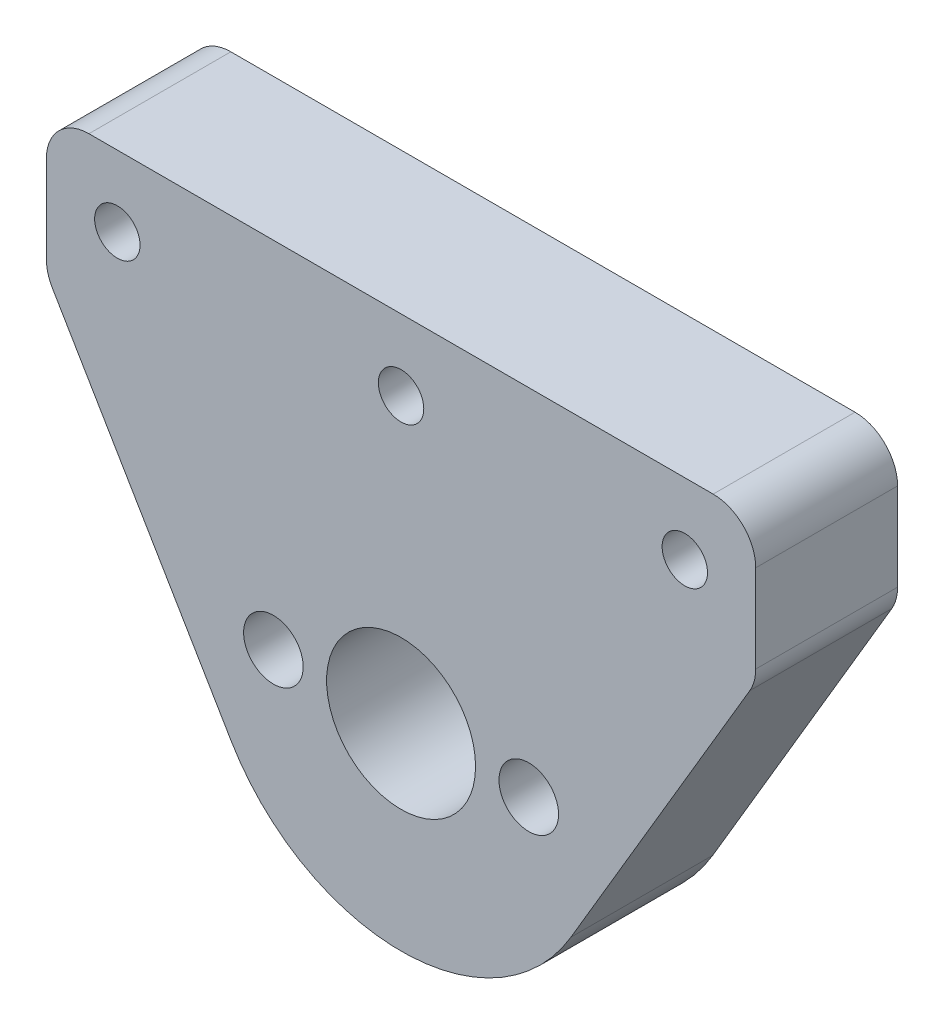
ISO-10303-21;
HEADER;
FILE_DESCRIPTION(('STEP AP214'),'2;1');
FILE_NAME('part.step','',(''),(''),'','','');
FILE_SCHEMA(('AUTOMOTIVE_DESIGN { 1 0 10303 214 1 1 1 1 }'));
ENDSEC;
DATA;
#1=APPLICATION_CONTEXT('core data for automotive mechanical design processes');
#2=APPLICATION_PROTOCOL_DEFINITION('international standard','automotive_design',2000,#1);
#3=PRODUCT_CONTEXT('',#1,'mechanical');
#4=PRODUCT('Part','Part','',(#3));
#5=PRODUCT_RELATED_PRODUCT_CATEGORY('part','',(#4));
#6=PRODUCT_DEFINITION_FORMATION('','',#4);
#7=PRODUCT_DEFINITION_CONTEXT('part definition',#1,'design');
#8=PRODUCT_DEFINITION('design','',#6,#7);
#9=PRODUCT_DEFINITION_SHAPE('','',#8);
#10=(LENGTH_UNIT() NAMED_UNIT(*) SI_UNIT(.MILLI.,.METRE.));
#11=(NAMED_UNIT(*) PLANE_ANGLE_UNIT() SI_UNIT($,.RADIAN.));
#12=(NAMED_UNIT(*) SI_UNIT($,.STERADIAN.) SOLID_ANGLE_UNIT());
#13=UNCERTAINTY_MEASURE_WITH_UNIT(LENGTH_MEASURE(1.E-05),#10,'distance_accuracy_value','');
#14=(GEOMETRIC_REPRESENTATION_CONTEXT(3) GLOBAL_UNCERTAINTY_ASSIGNED_CONTEXT((#13)) GLOBAL_UNIT_ASSIGNED_CONTEXT((#10,
#11,#12)) REPRESENTATION_CONTEXT('',''));
#15=CARTESIAN_POINT('',(0.,0.,0.));
#16=DIRECTION('',(0.,0.,1.));
#17=DIRECTION('',(1.,0.,0.));
#18=AXIS2_PLACEMENT_3D('',#15,#16,#17);
#19=CARTESIAN_POINT('',(0.,-20.,10.));
#20=DIRECTION('',(0.,0.,-1.));
#21=DIRECTION('',(-1.,0.,0.));
#22=AXIS2_PLACEMENT_3D('',#19,#20,#21);
#23=CYLINDRICAL_SURFACE('',#22,13.9);
#24=CARTESIAN_POINT('',(0.,-20.,0.));
#25=DIRECTION('',(0.,0.,1.));
#26=DIRECTION('',(1.,0.,0.));
#27=AXIS2_PLACEMENT_3D('',#24,#25,#26);
#28=CIRCLE('',#27,13.9);
#29=CARTESIAN_POINT('',(-11.9690237254858,-27.067706209143,0.));
#30=VERTEX_POINT('',#29);
#31=CARTESIAN_POINT('',(11.9690237254858,-27.067706209143,0.));
#32=VERTEX_POINT('',#31);
#33=EDGE_CURVE('E145',#30,#32,#28,.T.);
#34=ORIENTED_EDGE('',*,*,#33,.T.);
#35=DIRECTION('',(0.,0.,-1.));
#36=VECTOR('',#35,1.);
#37=CARTESIAN_POINT('',(11.9690237254858,-27.067706209143,10.));
#38=LINE('',#37,#36);
#39=CARTESIAN_POINT('',(11.9690237254858,-27.067706209143,10.));
#40=VERTEX_POINT('',#39);
#41=EDGE_CURVE('E124',#40,#32,#38,.T.);
#42=ORIENTED_EDGE('',*,*,#41,.F.);
#43=CARTESIAN_POINT('',(0.,-20.,10.));
#44=DIRECTION('',(0.,0.,1.));
#45=DIRECTION('',(1.,0.,0.));
#46=AXIS2_PLACEMENT_3D('',#43,#44,#45);
#47=CIRCLE('',#46,13.9);
#48=CARTESIAN_POINT('',(-11.9690237254858,-27.067706209143,10.));
#49=VERTEX_POINT('',#48);
#50=EDGE_CURVE('E130',#49,#40,#47,.T.);
#51=ORIENTED_EDGE('',*,*,#50,.F.);
#52=DIRECTION('',(0.,0.,-1.));
#53=VECTOR('',#52,1.);
#54=CARTESIAN_POINT('',(-11.9690237254858,-27.067706209143,10.));
#55=LINE('',#54,#53);
#56=EDGE_CURVE('E148',#49,#30,#55,.T.);
#57=ORIENTED_EDGE('',*,*,#56,.T.);
#58=EDGE_LOOP('',(#34,#42,#51,#57));
#59=FACE_BOUND('',#58,.T.);
#60=ADVANCED_FACE('F40',(#59),#23,.T.);
#61=CARTESIAN_POINT('',(20.7256660630455,-12.2385018262184,10.));
#62=DIRECTION('',(0.861080843560131,-0.50846807260021,0.));
#63=DIRECTION('',(0.50846807260021,0.861080843560131,0.));
#64=AXIS2_PLACEMENT_3D('',#61,#62,#63);
#65=PLANE('',#64);
#66=DIRECTION('',(-0.50846807260021,-0.861080843560131,0.));
#67=VECTOR('',#66,1.);
#68=CARTESIAN_POINT('',(20.7256660630455,-12.2385018262184,0.));
#69=LINE('',#68,#67);
#70=CARTESIAN_POINT('',(24.5832425306803,-5.70577071123963,0.));
#71=VERTEX_POINT('',#70);
#72=EDGE_CURVE('E228',#71,#32,#69,.T.);
#73=ORIENTED_EDGE('',*,*,#72,.F.);
#74=DIRECTION('',(0.,0.,-1.));
#75=VECTOR('',#74,1.);
#76=CARTESIAN_POINT('',(24.5832425306803,-5.70577071123963,10.));
#77=LINE('',#76,#75);
#78=CARTESIAN_POINT('',(24.5832425306803,-5.70577071123963,10.));
#79=VERTEX_POINT('',#78);
#80=EDGE_CURVE('E11',#71,#79,#77,.F.);
#81=ORIENTED_EDGE('',*,*,#80,.T.);
#82=DIRECTION('',(-0.50846807260021,-0.861080843560131,0.));
#83=VECTOR('',#82,1.);
#84=CARTESIAN_POINT('',(20.7256660630455,-12.2385018262184,10.));
#85=LINE('',#84,#83);
#86=EDGE_CURVE('E119',#79,#40,#85,.T.);
#87=ORIENTED_EDGE('',*,*,#86,.T.);
#88=ORIENTED_EDGE('',*,*,#41,.T.);
#89=EDGE_LOOP('',(#73,#81,#87,#88));
#90=FACE_BOUND('',#89,.T.);
#91=ADVANCED_FACE('F122',(#90),#65,.T.);
#92=CARTESIAN_POINT('',(24.9999999999999,0.,10.));
#93=DIRECTION('',(1.,0.,0.));
#94=DIRECTION('',(0.,1.,0.));
#95=AXIS2_PLACEMENT_3D('',#92,#93,#94);
#96=PLANE('',#95);
#97=DIRECTION('',(0.,-1.,0.));
#98=VECTOR('',#97,1.);
#99=CARTESIAN_POINT('',(24.9999999999999,0.,0.));
#100=LINE('',#99,#98);
#101=CARTESIAN_POINT('',(24.9999999999999,2.,0.));
#102=VERTEX_POINT('',#101);
#103=CARTESIAN_POINT('',(24.9999999999999,-4.180366493439,0.));
#104=VERTEX_POINT('',#103);
#105=EDGE_CURVE('E205',#102,#104,#100,.T.);
#106=ORIENTED_EDGE('',*,*,#105,.F.);
#107=DIRECTION('',(0.,0.,-1.));
#108=VECTOR('',#107,1.);
#109=CARTESIAN_POINT('',(24.9999999999999,2.,10.));
#110=LINE('',#109,#108);
#111=CARTESIAN_POINT('',(24.9999999999999,2.,10.));
#112=VERTEX_POINT('',#111);
#113=EDGE_CURVE('E49',#102,#112,#110,.F.);
#114=ORIENTED_EDGE('',*,*,#113,.T.);
#115=DIRECTION('',(0.,-1.,0.));
#116=VECTOR('',#115,1.);
#117=CARTESIAN_POINT('',(24.9999999999999,0.,10.));
#118=LINE('',#117,#116);
#119=CARTESIAN_POINT('',(24.9999999999999,-4.180366493439,10.));
#120=VERTEX_POINT('',#119);
#121=EDGE_CURVE('E129',#112,#120,#118,.T.);
#122=ORIENTED_EDGE('',*,*,#121,.T.);
#123=DIRECTION('',(0.,0.,-1.));
#124=VECTOR('',#123,1.);
#125=CARTESIAN_POINT('',(24.9999999999999,-4.180366493439,10.));
#126=LINE('',#125,#124);
#127=EDGE_CURVE('E194',#120,#104,#126,.T.);
#128=ORIENTED_EDGE('',*,*,#127,.T.);
#129=EDGE_LOOP('',(#106,#114,#122,#128));
#130=FACE_BOUND('',#129,.T.);
#131=ADVANCED_FACE('F202',(#130),#96,.T.);
#132=CARTESIAN_POINT('',(0.,5.,10.));
#133=DIRECTION('',(0.,-1.,0.));
#134=DIRECTION('',(1.,0.,0.));
#135=AXIS2_PLACEMENT_3D('',#132,#133,#134);
#136=PLANE('',#135);
#137=DIRECTION('',(-1.,0.,0.));
#138=VECTOR('',#137,1.);
#139=CARTESIAN_POINT('',(0.,5.,0.));
#140=LINE('',#139,#138);
#141=CARTESIAN_POINT('',(21.9999999999999,5.,0.));
#142=VERTEX_POINT('',#141);
#143=CARTESIAN_POINT('',(-22.,5.,0.));
#144=VERTEX_POINT('',#143);
#145=EDGE_CURVE('E214',#142,#144,#140,.T.);
#146=ORIENTED_EDGE('',*,*,#145,.T.);
#147=DIRECTION('',(0.,0.,-1.));
#148=VECTOR('',#147,1.);
#149=CARTESIAN_POINT('',(-22.,5.,10.));
#150=LINE('',#149,#148);
#151=CARTESIAN_POINT('',(-22.,5.,10.));
#152=VERTEX_POINT('',#151);
#153=EDGE_CURVE('E56',#144,#152,#150,.F.);
#154=ORIENTED_EDGE('',*,*,#153,.T.);
#155=DIRECTION('',(-1.,0.,0.));
#156=VECTOR('',#155,1.);
#157=CARTESIAN_POINT('',(0.,5.,10.));
#158=LINE('',#157,#156);
#159=CARTESIAN_POINT('',(21.9999999999999,5.,10.));
#160=VERTEX_POINT('',#159);
#161=EDGE_CURVE('E208',#160,#152,#158,.T.);
#162=ORIENTED_EDGE('',*,*,#161,.F.);
#163=DIRECTION('',(0.,0.,-1.));
#164=VECTOR('',#163,1.);
#165=CARTESIAN_POINT('',(21.9999999999999,5.,0.));
#166=LINE('',#165,#164);
#167=EDGE_CURVE('E188',#160,#142,#166,.T.);
#168=ORIENTED_EDGE('',*,*,#167,.T.);
#169=EDGE_LOOP('',(#146,#154,#162,#168));
#170=FACE_BOUND('',#169,.T.);
#171=ADVANCED_FACE('F213',(#170),#136,.F.);
#172=CARTESIAN_POINT('',(-25.,0.,10.));
#173=DIRECTION('',(1.,0.,0.));
#174=DIRECTION('',(0.,1.,0.));
#175=AXIS2_PLACEMENT_3D('',#172,#173,#174);
#176=PLANE('',#175);
#177=DIRECTION('',(0.,-1.,0.));
#178=VECTOR('',#177,1.);
#179=CARTESIAN_POINT('',(-25.,0.,0.));
#180=LINE('',#179,#178);
#181=CARTESIAN_POINT('',(-25.,2.,0.));
#182=VERTEX_POINT('',#181);
#183=CARTESIAN_POINT('',(-25.,-4.18036649343903,0.));
#184=VERTEX_POINT('',#183);
#185=EDGE_CURVE('E221',#182,#184,#180,.T.);
#186=ORIENTED_EDGE('',*,*,#185,.T.);
#187=DIRECTION('',(0.,0.,-1.));
#188=VECTOR('',#187,1.);
#189=CARTESIAN_POINT('',(-25.,-4.18036649343903,10.));
#190=LINE('',#189,#188);
#191=CARTESIAN_POINT('',(-25.,-4.18036649343903,10.));
#192=VERTEX_POINT('',#191);
#193=EDGE_CURVE('E174',#184,#192,#190,.F.);
#194=ORIENTED_EDGE('',*,*,#193,.T.);
#195=DIRECTION('',(0.,-1.,0.));
#196=VECTOR('',#195,1.);
#197=CARTESIAN_POINT('',(-25.,0.,10.));
#198=LINE('',#197,#196);
#199=CARTESIAN_POINT('',(-25.,2.,10.));
#200=VERTEX_POINT('',#199);
#201=EDGE_CURVE('E318',#200,#192,#198,.T.);
#202=ORIENTED_EDGE('',*,*,#201,.F.);
#203=DIRECTION('',(0.,0.,-1.));
#204=VECTOR('',#203,1.);
#205=CARTESIAN_POINT('',(-25.,2.,10.));
#206=LINE('',#205,#204);
#207=EDGE_CURVE('E170',#200,#182,#206,.T.);
#208=ORIENTED_EDGE('',*,*,#207,.T.);
#209=EDGE_LOOP('',(#186,#194,#202,#208));
#210=FACE_BOUND('',#209,.T.);
#211=ADVANCED_FACE('F335',(#210),#176,.F.);
#212=CARTESIAN_POINT('',(-20.,0.,10.));
#213=DIRECTION('',(0.,0.,-1.));
#214=DIRECTION('',(-1.,0.,0.));
#215=AXIS2_PLACEMENT_3D('',#212,#213,#214);
#216=CYLINDRICAL_SURFACE('',#215,1.6);
#217=CARTESIAN_POINT('',(-20.,0.,10.));
#218=DIRECTION('',(0.,0.,1.));
#219=DIRECTION('',(1.,0.,0.));
#220=AXIS2_PLACEMENT_3D('',#217,#218,#219);
#221=CIRCLE('',#220,1.6);
#222=CARTESIAN_POINT('',(-18.4,0.,10.));
#223=VERTEX_POINT('',#222);
#224=EDGE_CURVE('E300',#223,#223,#221,.T.);
#225=ORIENTED_EDGE('',*,*,#224,.T.);
#226=EDGE_LOOP('',(#225));
#227=FACE_BOUND('',#226,.T.);
#228=CARTESIAN_POINT('',(-20.,0.,0.));
#229=DIRECTION('',(0.,0.,1.));
#230=DIRECTION('',(1.,0.,0.));
#231=AXIS2_PLACEMENT_3D('',#228,#229,#230);
#232=CIRCLE('',#231,1.6);
#233=CARTESIAN_POINT('',(-18.4,0.,0.));
#234=VERTEX_POINT('',#233);
#235=EDGE_CURVE('E246',#234,#234,#232,.T.);
#236=ORIENTED_EDGE('',*,*,#235,.F.);
#237=EDGE_LOOP('',(#236));
#238=FACE_BOUND('',#237,.T.);
#239=ADVANCED_FACE('F356',(#227,#238),#216,.F.);
#240=CARTESIAN_POINT('',(0.,0.,10.));
#241=DIRECTION('',(0.,0.,-1.));
#242=DIRECTION('',(-1.,0.,0.));
#243=AXIS2_PLACEMENT_3D('',#240,#241,#242);
#244=CYLINDRICAL_SURFACE('',#243,1.6);
#245=CARTESIAN_POINT('',(0.,0.,10.));
#246=DIRECTION('',(0.,0.,1.));
#247=DIRECTION('',(1.,0.,0.));
#248=AXIS2_PLACEMENT_3D('',#245,#246,#247);
#249=CIRCLE('',#248,1.6);
#250=CARTESIAN_POINT('',(1.6,0.,10.));
#251=VERTEX_POINT('',#250);
#252=EDGE_CURVE('E304',#251,#251,#249,.T.);
#253=ORIENTED_EDGE('',*,*,#252,.T.);
#254=EDGE_LOOP('',(#253));
#255=FACE_BOUND('',#254,.T.);
#256=CARTESIAN_POINT('',(0.,0.,0.));
#257=DIRECTION('',(0.,0.,1.));
#258=DIRECTION('',(1.,0.,0.));
#259=AXIS2_PLACEMENT_3D('',#256,#257,#258);
#260=CIRCLE('',#259,1.6);
#261=CARTESIAN_POINT('',(1.6,0.,0.));
#262=VERTEX_POINT('',#261);
#263=EDGE_CURVE('E242',#262,#262,#260,.T.);
#264=ORIENTED_EDGE('',*,*,#263,.F.);
#265=EDGE_LOOP('',(#264));
#266=FACE_BOUND('',#265,.T.);
#267=ADVANCED_FACE('F377',(#255,#266),#244,.F.);
#268=CARTESIAN_POINT('',(9.,-20.,10.));
#269=DIRECTION('',(0.,0.,-1.));
#270=DIRECTION('',(-1.,0.,0.));
#271=AXIS2_PLACEMENT_3D('',#268,#269,#270);
#272=CYLINDRICAL_SURFACE('',#271,2.1);
#273=CARTESIAN_POINT('',(9.,-20.,10.));
#274=DIRECTION('',(0.,0.,1.));
#275=DIRECTION('',(1.,0.,0.));
#276=AXIS2_PLACEMENT_3D('',#273,#274,#275);
#277=CIRCLE('',#276,2.1);
#278=CARTESIAN_POINT('',(11.1,-20.,10.));
#279=VERTEX_POINT('',#278);
#280=EDGE_CURVE('E308',#279,#279,#277,.F.);
#281=ORIENTED_EDGE('',*,*,#280,.F.);
#282=EDGE_LOOP('',(#281));
#283=FACE_BOUND('',#282,.T.);
#284=CARTESIAN_POINT('',(9.,-20.,0.));
#285=DIRECTION('',(0.,0.,1.));
#286=DIRECTION('',(1.,0.,0.));
#287=AXIS2_PLACEMENT_3D('',#284,#285,#286);
#288=CIRCLE('',#287,2.1);
#289=CARTESIAN_POINT('',(11.1,-20.,0.));
#290=VERTEX_POINT('',#289);
#291=EDGE_CURVE('E238',#290,#290,#288,.F.);
#292=ORIENTED_EDGE('',*,*,#291,.T.);
#293=EDGE_LOOP('',(#292));
#294=FACE_BOUND('',#293,.T.);
#295=ADVANCED_FACE('F349',(#283,#294),#272,.F.);
#296=CARTESIAN_POINT('',(-9.,-20.,10.));
#297=DIRECTION('',(0.,0.,-1.));
#298=DIRECTION('',(-1.,0.,0.));
#299=AXIS2_PLACEMENT_3D('',#296,#297,#298);
#300=CYLINDRICAL_SURFACE('',#299,2.1);
#301=CARTESIAN_POINT('',(-9.,-20.,10.));
#302=DIRECTION('',(0.,0.,1.));
#303=DIRECTION('',(1.,0.,0.));
#304=AXIS2_PLACEMENT_3D('',#301,#302,#303);
#305=CIRCLE('',#304,2.1);
#306=CARTESIAN_POINT('',(-6.9,-20.,10.));
#307=VERTEX_POINT('',#306);
#308=EDGE_CURVE('E312',#307,#307,#305,.T.);
#309=ORIENTED_EDGE('',*,*,#308,.T.);
#310=EDGE_LOOP('',(#309));
#311=FACE_BOUND('',#310,.T.);
#312=CARTESIAN_POINT('',(-9.,-20.,0.));
#313=DIRECTION('',(0.,0.,1.));
#314=DIRECTION('',(1.,0.,0.));
#315=AXIS2_PLACEMENT_3D('',#312,#313,#314);
#316=CIRCLE('',#315,2.1);
#317=CARTESIAN_POINT('',(-6.9,-20.,0.));
#318=VERTEX_POINT('',#317);
#319=EDGE_CURVE('E234',#318,#318,#316,.T.);
#320=ORIENTED_EDGE('',*,*,#319,.F.);
#321=EDGE_LOOP('',(#320));
#322=FACE_BOUND('',#321,.T.);
#323=ADVANCED_FACE('F342',(#311,#322),#300,.F.);
#324=CARTESIAN_POINT('',(-20.7256660630455,-12.2385018262185,10.));
#325=DIRECTION('',(0.861080843560129,0.508468072600214,0.));
#326=DIRECTION('',(-0.508468072600214,0.861080843560129,0.));
#327=AXIS2_PLACEMENT_3D('',#324,#325,#326);
#328=PLANE('',#327);
#329=DIRECTION('',(0.508468072600214,-0.861080843560129,0.));
#330=VECTOR('',#329,1.);
#331=CARTESIAN_POINT('',(-20.7256660630455,-12.2385018262185,10.));
#332=LINE('',#331,#330);
#333=CARTESIAN_POINT('',(-24.5832425306804,-5.70577071123967,10.));
#334=VERTEX_POINT('',#333);
#335=EDGE_CURVE('E137',#334,#49,#332,.T.);
#336=ORIENTED_EDGE('',*,*,#335,.F.);
#337=DIRECTION('',(0.,0.,-1.));
#338=VECTOR('',#337,1.);
#339=CARTESIAN_POINT('',(-24.5832425306804,-5.70577071123967,10.));
#340=LINE('',#339,#338);
#341=CARTESIAN_POINT('',(-24.5832425306804,-5.70577071123967,0.));
#342=VERTEX_POINT('',#341);
#343=EDGE_CURVE('E147',#334,#342,#340,.T.);
#344=ORIENTED_EDGE('',*,*,#343,.T.);
#345=DIRECTION('',(0.508468072600214,-0.861080843560129,0.));
#346=VECTOR('',#345,1.);
#347=CARTESIAN_POINT('',(-20.7256660630455,-12.2385018262185,0.));
#348=LINE('',#347,#346);
#349=EDGE_CURVE('E226',#342,#30,#348,.T.);
#350=ORIENTED_EDGE('',*,*,#349,.T.);
#351=ORIENTED_EDGE('',*,*,#56,.F.);
#352=EDGE_LOOP('',(#336,#344,#350,#351));
#353=FACE_BOUND('',#352,.T.);
#354=ADVANCED_FACE('F340',(#353),#328,.F.);
#355=CARTESIAN_POINT('',(20.,0.,10.));
#356=DIRECTION('',(0.,0.,-1.));
#357=DIRECTION('',(-1.,0.,0.));
#358=AXIS2_PLACEMENT_3D('',#355,#356,#357);
#359=CYLINDRICAL_SURFACE('',#358,1.6);
#360=CARTESIAN_POINT('',(20.,0.,10.));
#361=DIRECTION('',(0.,0.,1.));
#362=DIRECTION('',(1.,0.,0.));
#363=AXIS2_PLACEMENT_3D('',#360,#361,#362);
#364=CIRCLE('',#363,1.6);
#365=CARTESIAN_POINT('',(21.6,0.,10.));
#366=VERTEX_POINT('',#365);
#367=EDGE_CURVE('E155',#366,#366,#364,.F.);
#368=ORIENTED_EDGE('',*,*,#367,.F.);
#369=EDGE_LOOP('',(#368));
#370=FACE_BOUND('',#369,.T.);
#371=CARTESIAN_POINT('',(20.,0.,0.));
#372=DIRECTION('',(0.,0.,1.));
#373=DIRECTION('',(1.,0.,0.));
#374=AXIS2_PLACEMENT_3D('',#371,#372,#373);
#375=CIRCLE('',#374,1.6);
#376=CARTESIAN_POINT('',(21.6,0.,0.));
#377=VERTEX_POINT('',#376);
#378=EDGE_CURVE('E142',#377,#377,#375,.F.);
#379=ORIENTED_EDGE('',*,*,#378,.T.);
#380=EDGE_LOOP('',(#379));
#381=FACE_BOUND('',#380,.T.);
#382=ADVANCED_FACE('F253',(#370,#381),#359,.F.);
#383=CARTESIAN_POINT('',(0.,0.,10.));
#384=DIRECTION('',(0.,0.,1.));
#385=DIRECTION('',(1.,0.,0.));
#386=AXIS2_PLACEMENT_3D('',#383,#384,#385);
#387=PLANE('',#386);
#388=CARTESIAN_POINT('',(0.,-20.,10.));
#389=DIRECTION('',(0.,0.,1.));
#390=DIRECTION('',(1.,0.,0.));
#391=AXIS2_PLACEMENT_3D('',#388,#389,#390);
#392=CIRCLE('',#391,5.25);
#393=CARTESIAN_POINT('',(5.25,-20.,10.));
#394=VERTEX_POINT('',#393);
#395=EDGE_CURVE('E323',#394,#394,#392,.T.);
#396=ORIENTED_EDGE('',*,*,#395,.F.);
#397=EDGE_LOOP('',(#396));
#398=FACE_BOUND('',#397,.T.);
#399=ORIENTED_EDGE('',*,*,#201,.T.);
#400=CARTESIAN_POINT('',(-22.,-4.18036649343903,10.));
#401=DIRECTION('',(0.,0.,1.));
#402=DIRECTION('',(1.,0.,0.));
#403=AXIS2_PLACEMENT_3D('',#400,#401,#402);
#404=CIRCLE('',#403,3.);
#405=EDGE_CURVE('E185',#192,#334,#404,.T.);
#406=ORIENTED_EDGE('',*,*,#405,.T.);
#407=ORIENTED_EDGE('',*,*,#335,.T.);
#408=ORIENTED_EDGE('',*,*,#50,.T.);
#409=ORIENTED_EDGE('',*,*,#86,.F.);
#410=CARTESIAN_POINT('',(21.9999999999999,-4.180366493439,10.));
#411=DIRECTION('',(0.,0.,1.));
#412=DIRECTION('',(1.,0.,0.));
#413=AXIS2_PLACEMENT_3D('',#410,#411,#412);
#414=CIRCLE('',#413,3.);
#415=EDGE_CURVE('E177',#79,#120,#414,.T.);
#416=ORIENTED_EDGE('',*,*,#415,.T.);
#417=ORIENTED_EDGE('',*,*,#121,.F.);
#418=CARTESIAN_POINT('',(21.9999999999999,2.,10.));
#419=DIRECTION('',(0.,0.,1.));
#420=DIRECTION('',(1.,0.,0.));
#421=AXIS2_PLACEMENT_3D('',#418,#419,#420);
#422=CIRCLE('',#421,3.);
#423=EDGE_CURVE('E63',#112,#160,#422,.T.);
#424=ORIENTED_EDGE('',*,*,#423,.T.);
#425=ORIENTED_EDGE('',*,*,#161,.T.);
#426=CARTESIAN_POINT('',(-22.,2.,10.));
#427=DIRECTION('',(0.,0.,1.));
#428=DIRECTION('',(1.,0.,0.));
#429=AXIS2_PLACEMENT_3D('',#426,#427,#428);
#430=CIRCLE('',#429,3.);
#431=EDGE_CURVE('E182',#152,#200,#430,.T.);
#432=ORIENTED_EDGE('',*,*,#431,.T.);
#433=EDGE_LOOP('',(#399,#406,#407,#408,#409,#416,#417,#424,#425,#432));
#434=FACE_BOUND('',#433,.T.);
#435=ORIENTED_EDGE('',*,*,#308,.F.);
#436=EDGE_LOOP('',(#435));
#437=FACE_BOUND('',#436,.T.);
#438=ORIENTED_EDGE('',*,*,#280,.T.);
#439=EDGE_LOOP('',(#438));
#440=FACE_BOUND('',#439,.T.);
#441=ORIENTED_EDGE('',*,*,#252,.F.);
#442=EDGE_LOOP('',(#441));
#443=FACE_BOUND('',#442,.T.);
#444=ORIENTED_EDGE('',*,*,#224,.F.);
#445=EDGE_LOOP('',(#444));
#446=FACE_BOUND('',#445,.T.);
#447=ORIENTED_EDGE('',*,*,#367,.T.);
#448=EDGE_LOOP('',(#447));
#449=FACE_BOUND('',#448,.T.);
#450=ADVANCED_FACE('F134',(#398,#434,#437,#440,#443,#446,#449),#387,.T.);
#451=CARTESIAN_POINT('',(0.,0.,0.));
#452=DIRECTION('',(0.,0.,1.));
#453=DIRECTION('',(1.,0.,0.));
#454=AXIS2_PLACEMENT_3D('',#451,#452,#453);
#455=PLANE('',#454);
#456=CARTESIAN_POINT('',(0.,-20.,0.));
#457=DIRECTION('',(0.,0.,1.));
#458=DIRECTION('',(1.,0.,0.));
#459=AXIS2_PLACEMENT_3D('',#456,#457,#458);
#460=CIRCLE('',#459,5.25);
#461=CARTESIAN_POINT('',(5.25,-20.,0.));
#462=VERTEX_POINT('',#461);
#463=EDGE_CURVE('E294',#462,#462,#460,.T.);
#464=ORIENTED_EDGE('',*,*,#463,.T.);
#465=EDGE_LOOP('',(#464));
#466=FACE_BOUND('',#465,.T.);
#467=ORIENTED_EDGE('',*,*,#349,.F.);
#468=CARTESIAN_POINT('',(-22.,-4.18036649343903,0.));
#469=DIRECTION('',(0.,0.,1.));
#470=DIRECTION('',(1.,0.,0.));
#471=AXIS2_PLACEMENT_3D('',#468,#469,#470);
#472=CIRCLE('',#471,3.);
#473=EDGE_CURVE('E167',#342,#184,#472,.F.);
#474=ORIENTED_EDGE('',*,*,#473,.T.);
#475=ORIENTED_EDGE('',*,*,#185,.F.);
#476=CARTESIAN_POINT('',(-22.,2.,0.));
#477=DIRECTION('',(0.,0.,1.));
#478=DIRECTION('',(1.,0.,0.));
#479=AXIS2_PLACEMENT_3D('',#476,#477,#478);
#480=CIRCLE('',#479,3.);
#481=EDGE_CURVE('E164',#182,#144,#480,.F.);
#482=ORIENTED_EDGE('',*,*,#481,.T.);
#483=ORIENTED_EDGE('',*,*,#145,.F.);
#484=CARTESIAN_POINT('',(21.9999999999999,2.,0.));
#485=DIRECTION('',(0.,0.,1.));
#486=DIRECTION('',(1.,0.,0.));
#487=AXIS2_PLACEMENT_3D('',#484,#485,#486);
#488=CIRCLE('',#487,3.);
#489=EDGE_CURVE('E161',#142,#102,#488,.F.);
#490=ORIENTED_EDGE('',*,*,#489,.T.);
#491=ORIENTED_EDGE('',*,*,#105,.T.);
#492=CARTESIAN_POINT('',(21.9999999999999,-4.180366493439,0.));
#493=DIRECTION('',(0.,0.,1.));
#494=DIRECTION('',(1.,0.,0.));
#495=AXIS2_PLACEMENT_3D('',#492,#493,#494);
#496=CIRCLE('',#495,3.);
#497=EDGE_CURVE('E153',#104,#71,#496,.F.);
#498=ORIENTED_EDGE('',*,*,#497,.T.);
#499=ORIENTED_EDGE('',*,*,#72,.T.);
#500=ORIENTED_EDGE('',*,*,#33,.F.);
#501=EDGE_LOOP('',(#467,#474,#475,#482,#483,#490,#491,#498,#499,#500));
#502=FACE_BOUND('',#501,.T.);
#503=ORIENTED_EDGE('',*,*,#319,.T.);
#504=EDGE_LOOP('',(#503));
#505=FACE_BOUND('',#504,.T.);
#506=ORIENTED_EDGE('',*,*,#291,.F.);
#507=EDGE_LOOP('',(#506));
#508=FACE_BOUND('',#507,.T.);
#509=ORIENTED_EDGE('',*,*,#263,.T.);
#510=EDGE_LOOP('',(#509));
#511=FACE_BOUND('',#510,.T.);
#512=ORIENTED_EDGE('',*,*,#235,.T.);
#513=EDGE_LOOP('',(#512));
#514=FACE_BOUND('',#513,.T.);
#515=ORIENTED_EDGE('',*,*,#378,.F.);
#516=EDGE_LOOP('',(#515));
#517=FACE_BOUND('',#516,.T.);
#518=ADVANCED_FACE('F217',(#466,#502,#505,#508,#511,#514,#517),#455,.F.);
#519=CARTESIAN_POINT('',(-22.,-4.18036649343903,10.));
#520=DIRECTION('',(0.,0.,-1.));
#521=DIRECTION('',(-1.,0.,0.));
#522=AXIS2_PLACEMENT_3D('',#519,#520,#521);
#523=CYLINDRICAL_SURFACE('',#522,3.);
#524=ORIENTED_EDGE('',*,*,#405,.F.);
#525=ORIENTED_EDGE('',*,*,#193,.F.);
#526=ORIENTED_EDGE('',*,*,#473,.F.);
#527=ORIENTED_EDGE('',*,*,#343,.F.);
#528=EDGE_LOOP('',(#524,#525,#526,#527));
#529=FACE_BOUND('',#528,.T.);
#530=ADVANCED_FACE('F256',(#529),#523,.T.);
#531=CARTESIAN_POINT('',(-22.,2.,10.));
#532=DIRECTION('',(0.,0.,-1.));
#533=DIRECTION('',(-1.,0.,0.));
#534=AXIS2_PLACEMENT_3D('',#531,#532,#533);
#535=CYLINDRICAL_SURFACE('',#534,3.);
#536=ORIENTED_EDGE('',*,*,#431,.F.);
#537=ORIENTED_EDGE('',*,*,#153,.F.);
#538=ORIENTED_EDGE('',*,*,#481,.F.);
#539=ORIENTED_EDGE('',*,*,#207,.F.);
#540=EDGE_LOOP('',(#536,#537,#538,#539));
#541=FACE_BOUND('',#540,.T.);
#542=ADVANCED_FACE('F264',(#541),#535,.T.);
#543=CARTESIAN_POINT('',(21.9999999999999,2.,10.));
#544=DIRECTION('',(0.,0.,1.));
#545=DIRECTION('',(1.,0.,0.));
#546=AXIS2_PLACEMENT_3D('',#543,#544,#545);
#547=CYLINDRICAL_SURFACE('',#546,3.);
#548=ORIENTED_EDGE('',*,*,#423,.F.);
#549=ORIENTED_EDGE('',*,*,#113,.F.);
#550=ORIENTED_EDGE('',*,*,#489,.F.);
#551=ORIENTED_EDGE('',*,*,#167,.F.);
#552=EDGE_LOOP('',(#548,#549,#550,#551));
#553=FACE_BOUND('',#552,.T.);
#554=ADVANCED_FACE('F211',(#553),#547,.T.);
#555=CARTESIAN_POINT('',(21.9999999999999,-4.180366493439,10.));
#556=DIRECTION('',(0.,0.,-1.));
#557=DIRECTION('',(-1.,0.,0.));
#558=AXIS2_PLACEMENT_3D('',#555,#556,#557);
#559=CYLINDRICAL_SURFACE('',#558,3.);
#560=ORIENTED_EDGE('',*,*,#415,.F.);
#561=ORIENTED_EDGE('',*,*,#80,.F.);
#562=ORIENTED_EDGE('',*,*,#497,.F.);
#563=ORIENTED_EDGE('',*,*,#127,.F.);
#564=EDGE_LOOP('',(#560,#561,#562,#563));
#565=FACE_BOUND('',#564,.T.);
#566=ADVANCED_FACE('F42',(#565),#559,.T.);
#567=CARTESIAN_POINT('',(0.,-20.,0.));
#568=DIRECTION('',(0.,0.,1.));
#569=DIRECTION('',(1.,0.,0.));
#570=AXIS2_PLACEMENT_3D('',#567,#568,#569);
#571=CYLINDRICAL_SURFACE('',#570,5.25);
#572=ORIENTED_EDGE('',*,*,#463,.F.);
#573=EDGE_LOOP('',(#572));
#574=FACE_BOUND('',#573,.T.);
#575=ORIENTED_EDGE('',*,*,#395,.T.);
#576=EDGE_LOOP('',(#575));
#577=FACE_BOUND('',#576,.T.);
#578=ADVANCED_FACE('F285',(#574,#577),#571,.F.);
#579=CLOSED_SHELL('',(#60,#91,#131,#171,#211,#239,#267,#295,#323,#354,#382,#450,#518,#530,#542,
#554,#566,#578));
#580=MANIFOLD_SOLID_BREP('B2',#579);
#581=ADVANCED_BREP_SHAPE_REPRESENTATION('',(#18,#580),#14);
#582=SHAPE_DEFINITION_REPRESENTATION(#9,#581);
ENDSEC;
END-ISO-10303-21;
